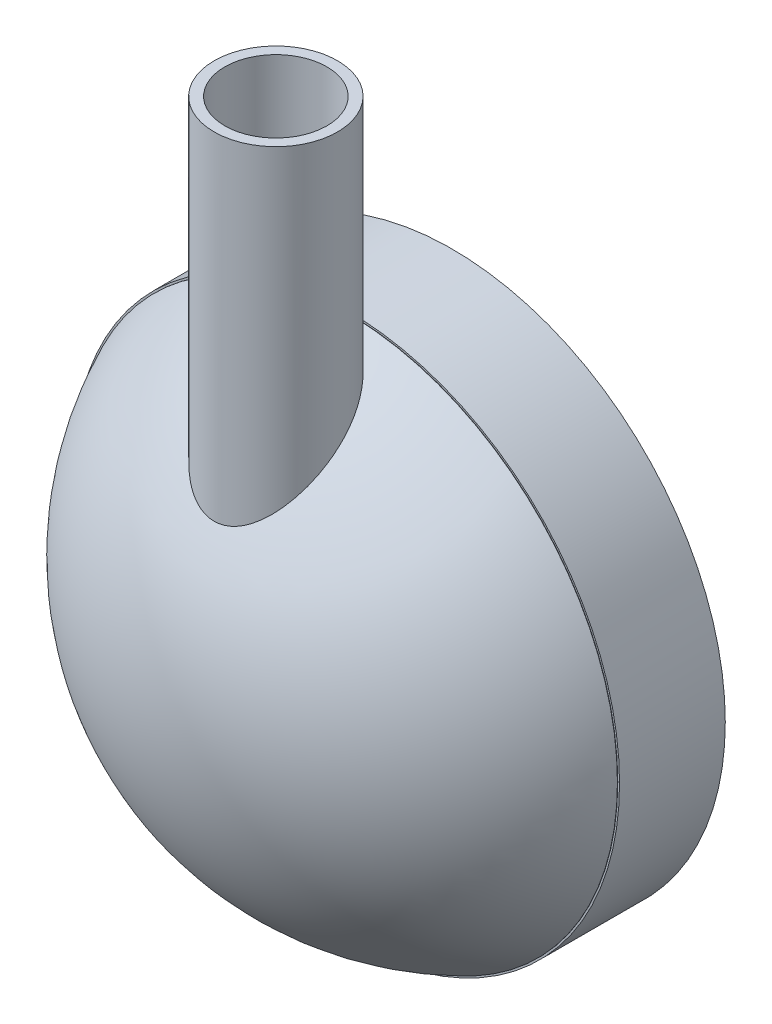
ISO-10303-21;
HEADER;
FILE_DESCRIPTION(('STEP AP214'),'2;1');
FILE_NAME('part.step','',(''),(''),'','','');
FILE_SCHEMA(('AUTOMOTIVE_DESIGN { 1 0 10303 214 1 1 1 1 }'));
ENDSEC;
DATA;
#1=APPLICATION_CONTEXT('core data for automotive mechanical design processes');
#2=APPLICATION_PROTOCOL_DEFINITION('international standard','automotive_design',2000,#1);
#3=PRODUCT_CONTEXT('',#1,'mechanical');
#4=PRODUCT('Part','Part','',(#3));
#5=PRODUCT_RELATED_PRODUCT_CATEGORY('part','',(#4));
#6=PRODUCT_DEFINITION_FORMATION('','',#4);
#7=PRODUCT_DEFINITION_CONTEXT('part definition',#1,'design');
#8=PRODUCT_DEFINITION('design','',#6,#7);
#9=PRODUCT_DEFINITION_SHAPE('','',#8);
#10=(LENGTH_UNIT() NAMED_UNIT(*) SI_UNIT(.MILLI.,.METRE.));
#11=(NAMED_UNIT(*) PLANE_ANGLE_UNIT() SI_UNIT($,.RADIAN.));
#12=(NAMED_UNIT(*) SI_UNIT($,.STERADIAN.) SOLID_ANGLE_UNIT());
#13=UNCERTAINTY_MEASURE_WITH_UNIT(LENGTH_MEASURE(1.E-05),#10,'distance_accuracy_value','');
#14=(GEOMETRIC_REPRESENTATION_CONTEXT(3) GLOBAL_UNCERTAINTY_ASSIGNED_CONTEXT((#13)) GLOBAL_UNIT_ASSIGNED_CONTEXT((#10,
#11,#12)) REPRESENTATION_CONTEXT('',''));
#15=CARTESIAN_POINT('',(0.,0.,0.));
#16=DIRECTION('',(0.,0.,1.));
#17=DIRECTION('',(1.,0.,0.));
#18=AXIS2_PLACEMENT_3D('',#15,#16,#17);
#19=CARTESIAN_POINT('',(0.,0.,-4.19));
#20=DIRECTION('',(0.,0.,1.));
#21=DIRECTION('',(1.,0.,0.));
#22=AXIS2_PLACEMENT_3D('',#19,#20,#21);
#23=SPHERICAL_SURFACE('',#22,84.29);
#24=CARTESIAN_POINT('',(0.,0.,30.1));
#25=DIRECTION('',(0.,0.,1.));
#26=DIRECTION('',(1.,0.,0.));
#27=AXIS2_PLACEMENT_3D('',#24,#25,#26);
#28=CIRCLE('',#27,77.);
#29=CARTESIAN_POINT('',(77.,0.,30.1));
#30=VERTEX_POINT('',#29);
#31=EDGE_CURVE('E62',#30,#30,#28,.T.);
#32=ORIENTED_EDGE('',*,*,#31,.T.);
#33=EDGE_LOOP('',(#32));
#34=FACE_BOUND('',#33,.T.);
#35=CARTESIAN_POINT('',(-9.63469222474683,47.7354714035888,64.60899400145));
#36=CARTESIAN_POINT('',(-10.1618205342646,48.1301078161645,64.2613591958156));
#37=CARTESIAN_POINT('',(-10.6598401083609,48.54443973879,63.8920349933327));
#38=CARTESIAN_POINT('',(-11.6001915047244,49.4019815851679,63.117055940327));
#39=CARTESIAN_POINT('',(-12.0424672587567,49.8452199144252,62.7113652022849));
#40=CARTESIAN_POINT('',(-12.8748919288327,50.7542676089717,61.8675936176552));
#41=CARTESIAN_POINT('',(-13.2648143014862,51.2201638893899,61.4293839881722));
#42=CARTESIAN_POINT('',(-13.9920775643734,52.1666323180765,60.5265228676071));
#43=CARTESIAN_POINT('',(-14.3294303558921,52.6472011150688,60.0618773939764));
#44=CARTESIAN_POINT('',(-15.0048715252983,53.6993930787682,59.0302077687342));
#45=CARTESIAN_POINT('',(-15.3337355513558,54.2728576564931,58.4590160757762));
#46=CARTESIAN_POINT('',(-15.9227985749101,55.4278808015276,57.2899227595152));
#47=CARTESIAN_POINT('',(-16.1829826983682,56.0094410934678,56.6920153831138));
#48=CARTESIAN_POINT('',(-16.6343709008459,57.1753768372738,55.474385199071));
#49=CARTESIAN_POINT('',(-16.8256319664791,57.7597495567494,54.8546808809959));
#50=CARTESIAN_POINT('',(-17.1385355013989,58.9276490449231,53.5972613943492));
#51=CARTESIAN_POINT('',(-17.2601838944337,59.5111758813859,52.9595477631429));
#52=CARTESIAN_POINT('',(-17.4327186269732,60.6770020442723,51.6667389045581));
#53=CARTESIAN_POINT('',(-17.48319473154,61.2592750931872,51.0115649106));
#54=CARTESIAN_POINT('',(-17.5097293203734,62.4154871113066,49.6921866750521));
#55=CARTESIAN_POINT('',(-17.4857794353213,62.9894251359333,49.0279814262455));
#56=CARTESIAN_POINT('',(-17.3606388075821,64.1244254084989,47.6967879036881));
#57=CARTESIAN_POINT('',(-17.2595171079876,64.6854987041661,47.0298026473092));
#58=CARTESIAN_POINT('',(-16.9768777377061,65.7908638869868,45.6990717075079));
#59=CARTESIAN_POINT('',(-16.7953893072266,66.3351618006386,45.0353249345314));
#60=CARTESIAN_POINT('',(-16.40825743448,67.2598092913092,43.8943472468209));
#61=CARTESIAN_POINT('',(-16.2219528126971,67.645181526494,43.4145669660618));
#62=CARTESIAN_POINT('',(-15.8029766066737,68.4021249148378,42.4643886073296));
#63=CARTESIAN_POINT('',(-15.5703093071199,68.773697339568,41.99398966678));
#64=CARTESIAN_POINT('',(-15.0576774407298,69.5001923526423,41.067107534959));
#65=CARTESIAN_POINT('',(-14.7777601672961,69.8551311404656,40.6106109626055));
#66=CARTESIAN_POINT('',(-14.1695533701949,70.5459205633203,39.7157254486219));
#67=CARTESIAN_POINT('',(-13.8412725768339,70.8817746282861,39.2773332571405));
#68=CARTESIAN_POINT('',(-13.2023445260508,71.4700368359492,38.5043491639211));
#69=CARTESIAN_POINT('',(-12.9000217971659,71.7262474310145,38.1657586455133));
#70=CARTESIAN_POINT('',(-12.2632768102596,72.2221353602219,37.5071288419921));
#71=CARTESIAN_POINT('',(-11.9288567594121,72.4618138292511,37.1870882837138));
#72=CARTESIAN_POINT('',(-11.2285420597239,72.9224672159558,36.5691528354973));
#73=CARTESIAN_POINT('',(-10.8626705019345,73.1434556229669,36.2712419929207));
#74=CARTESIAN_POINT('',(-10.2910247606245,73.4593176201155,35.8436774057029));
#75=CARTESIAN_POINT('',(-10.0966717889131,73.56200059044,35.7043740888836));
#76=CARTESIAN_POINT('',(-9.70044239834155,73.7619333636111,35.432599911407));
#77=CARTESIAN_POINT('',(-9.49856402947543,73.8591817416829,35.3001308431619));
#78=CARTESIAN_POINT('',(-8.94363972514514,74.1140082492897,34.9523668853453));
#79=CARTESIAN_POINT('',(-8.58369169980151,74.266168495155,34.7439997093504));
#80=CARTESIAN_POINT('',(-7.84428678075661,74.552407497084,34.35095987583));
#81=CARTESIAN_POINT('',(-7.4648330893419,74.6864892081271,34.1662833462524));
#82=CARTESIAN_POINT('',(-6.68824586279277,74.9351995833017,33.8229316554532));
#83=CARTESIAN_POINT('',(-6.29111583251415,75.0498320823145,33.6642513686579));
#84=CARTESIAN_POINT('',(-5.48141543375667,75.2583598203042,33.3750522250976));
#85=CARTESIAN_POINT('',(-5.06884483819789,75.3522547541593,33.2445337826918));
#86=CARTESIAN_POINT('',(-4.22900089526582,75.5185385298484,33.0130586426871));
#87=CARTESIAN_POINT('',(-3.80166602897488,75.5908210359454,32.9122481456367));
#88=CARTESIAN_POINT('',(-2.9374339086655,75.7122905584037,32.7426716822289));
#89=CARTESIAN_POINT('',(-2.50053657614264,75.7614773850834,32.6739059790513));
#90=CARTESIAN_POINT('',(-1.62089108564555,75.8360473677517,32.5696006126215));
#91=CARTESIAN_POINT('',(-1.17814451307177,75.8614368448748,32.534052126105));
#92=CARTESIAN_POINT('',(-0.290521118924459,75.888060085238,32.4967754320609));
#93=CARTESIAN_POINT('',(0.154355543383838,75.8892956270875,32.4950447343124));
#94=CARTESIAN_POINT('',(1.00427134557051,75.868532614469,32.5241173433024));
#95=CARTESIAN_POINT('',(1.40945807804371,75.8485155726792,32.5521460020332));
#96=CARTESIAN_POINT('',(2.21541841251261,75.7885319830104,32.6360704982499));
#97=CARTESIAN_POINT('',(2.61619230988984,75.7485667787992,32.6919644587852));
#98=CARTESIAN_POINT('',(3.41051709435133,75.649169143576,32.8308144560516));
#99=CARTESIAN_POINT('',(3.8040686411958,75.5897385001702,32.9137680077659));
#100=CARTESIAN_POINT('',(4.58143821841471,75.4520886492022,33.1056011165695));
#101=CARTESIAN_POINT('',(4.96525597674825,75.3738689171591,33.2144813973799));
#102=CARTESIAN_POINT('',(5.72313704093458,75.198963904414,33.4574784488773));
#103=CARTESIAN_POINT('',(6.09712797888756,75.1021706173499,33.591742758381));
#104=CARTESIAN_POINT('',(6.83094347134723,74.8914142138743,33.883421060978));
#105=CARTESIAN_POINT('',(7.19076811668743,74.7774512075766,34.040834905607));
#106=CARTESIAN_POINT('',(7.89465295126496,74.5334041692978,34.3770487750717));
#107=CARTESIAN_POINT('',(8.23871086645541,74.4033178217967,34.5558518715514));
#108=CARTESIAN_POINT('',(8.90971456153488,74.1281375902148,34.9329779550346));
#109=CARTESIAN_POINT('',(9.23665828645599,73.9830419101016,35.1313032779506));
#110=CARTESIAN_POINT('',(9.90573929639754,73.6630107252022,35.5673283457427));
#111=CARTESIAN_POINT('',(10.2458754742925,73.4865416262001,35.8069762094788));
#112=CARTESIAN_POINT('',(10.9029705179701,73.1181635343707,36.3052789334953));
#113=CARTESIAN_POINT('',(11.2199280249768,72.9262536377586,36.5639349062866));
#114=CARTESIAN_POINT('',(12.1351951493392,72.3293906764523,37.364968369668));
#115=CARTESIAN_POINT('',(12.6980501326201,71.9032313199886,37.9325112840581));
#116=CARTESIAN_POINT('',(13.8153092432989,70.9276763766797,39.2188524294654));
#117=CARTESIAN_POINT('',(14.3515388558225,70.3696997304661,39.9468612142282));
#118=CARTESIAN_POINT('',(15.0574001798865,69.4965647035361,41.0713313107249));
#119=CARTESIAN_POINT('',(15.2763728128412,69.1993065738174,41.4517965996273));
#120=CARTESIAN_POINT('',(15.6822024611091,68.5940310605825,42.2213354522294));
#121=CARTESIAN_POINT('',(15.8690581066944,68.2860132188591,42.6104093822726));
#122=CARTESIAN_POINT('',(16.2468215615074,67.595662480056,43.4763521626213));
#123=CARTESIAN_POINT('',(16.4305029456572,67.2111872967619,43.9546643777718));
#124=CARTESIAN_POINT('',(16.753221773707,66.4307802273104,44.9169748374916));
#125=CARTESIAN_POINT('',(16.8922540684864,66.0348470255018,45.4009737312056));
#126=CARTESIAN_POINT('',(17.1270271526935,65.2333596175696,46.3717238364064));
#127=CARTESIAN_POINT('',(17.2227540906127,64.8278023767255,46.8584758781719));
#128=CARTESIAN_POINT('',(17.3721554649138,64.0089496259527,47.8318882730032));
#129=CARTESIAN_POINT('',(17.4258281133951,63.5956537877893,48.3185486212913));
#130=CARTESIAN_POINT('',(17.4990653292932,62.6786614398899,49.3876534694212));
#131=CARTESIAN_POINT('',(17.5095325874107,62.1735920563319,49.9695571630562));
#132=CARTESIAN_POINT('',(17.4733127289245,61.1572253854348,51.1261314749178));
#133=CARTESIAN_POINT('',(17.4266185182455,60.6459273328785,51.7008011864217));
#134=CARTESIAN_POINT('',(17.2775256419665,59.6189649711866,52.8403857460969));
#135=CARTESIAN_POINT('',(17.1750480212357,59.1032954956251,53.4052855940564));
#136=CARTESIAN_POINT('',(16.9155278959145,58.0709323764062,54.5214182378472));
#137=CARTESIAN_POINT('',(16.7584848567309,57.554238722764,55.0726508997204));
#138=CARTESIAN_POINT('',(16.3654609573264,56.4521422578945,56.2326729481332));
#139=CARTESIAN_POINT('',(16.1216336085227,55.8669828833373,56.8390544540945));
#140=CARTESIAN_POINT('',(15.5646818130478,54.7033006305848,58.0262546607971));
#141=CARTESIAN_POINT('',(15.2515373348647,54.1247797217331,58.6070659138686));
#142=CARTESIAN_POINT('',(14.5557734065386,52.980856112026,59.7375307517814));
#143=CARTESIAN_POINT('',(14.1732462274002,52.4154371001144,60.2872244605005));
#144=CARTESIAN_POINT('',(13.3367941374115,51.3042138411895,61.3506515766683));
#145=CARTESIAN_POINT('',(12.8829148198834,50.758397340106,61.864407647056));
#146=CARTESIAN_POINT('',(12.0971461463222,49.9082458353304,62.6524007323927));
#147=CARTESIAN_POINT('',(11.7889548607783,49.5945464156342,62.9403344118918));
#148=CARTESIAN_POINT('',(11.1449325489721,48.9803409273614,63.4989698201894));
#149=CARTESIAN_POINT('',(10.8091035769792,48.6798338807563,63.7696728270712));
#150=CARTESIAN_POINT('',(10.1094351403764,48.095725457479,64.2912383872606));
#151=CARTESIAN_POINT('',(9.74563112150831,47.8121034698412,64.5421252569746));
#152=CARTESIAN_POINT('',(8.98894967525549,47.2655118392575,65.021627590362));
#153=CARTESIAN_POINT('',(8.59607976019743,47.0025368958763,65.2502487736503));
#154=CARTESIAN_POINT('',(7.8812751415455,46.563878785359,65.6287030081285));
#155=CARTESIAN_POINT('',(7.56567687677083,46.3826400194559,65.7840795090202));
#156=CARTESIAN_POINT('',(6.91786225852598,46.0373180474911,66.078548978292));
#157=CARTESIAN_POINT('',(6.58564678442967,45.8732339350313,66.2176428070441));
#158=CARTESIAN_POINT('',(5.90550359275257,45.5652526307485,66.4774816373325));
#159=CARTESIAN_POINT('',(5.55759360690272,45.421333376055,66.5982467050563));
#160=CARTESIAN_POINT('',(4.84684547420208,45.1565624699132,66.8195277188379));
#161=CARTESIAN_POINT('',(4.48401031902267,45.0357062227309,66.9200476993282));
#162=CARTESIAN_POINT('',(3.81086094112527,44.8392958210442,67.0828881288511));
#163=CARTESIAN_POINT('',(3.50265275858346,44.7595083689323,67.148821885709));
#164=CARTESIAN_POINT('',(2.87890510917004,44.6192559439055,67.2644854125106));
#165=CARTESIAN_POINT('',(2.56336712427924,44.5587871008994,67.3142184279831));
#166=CARTESIAN_POINT('',(1.92699260035902,44.4585609623175,67.3965388324821));
#167=CARTESIAN_POINT('',(1.60615948100956,44.4187908006546,67.4291368725587));
#168=CARTESIAN_POINT('',(0.961223106558646,44.3608827564995,67.4765724978154));
#169=CARTESIAN_POINT('',(0.637119821686242,44.3427450711249,67.4914099211588));
#170=CARTESIAN_POINT('',(-0.0125559970443343,44.328558096109,67.5030170701446));
#171=CARTESIAN_POINT('',(-0.338130177783476,44.3325537066235,67.4997500686943));
#172=CARTESIAN_POINT('',(-0.987562485381796,44.3626325041723,67.4751343337306));
#173=CARTESIAN_POINT('',(-1.31142060095197,44.3887158363281,67.4537854814152));
#174=CARTESIAN_POINT('',(-1.95519098192867,44.4623225126324,67.3934417943763));
#175=CARTESIAN_POINT('',(-2.27510097598812,44.5098576566356,67.354437247867));
#176=CARTESIAN_POINT('',(-2.90866854452908,44.6252241460277,67.2595560721638));
#177=CARTESIAN_POINT('',(-3.22232604365041,44.6930557358883,67.2036792397423));
#178=CARTESIAN_POINT('',(-3.83634585943456,44.8462076476786,67.0771489352492));
#179=CARTESIAN_POINT('',(-4.13684386956309,44.9312085945944,67.0067648896112));
#180=CARTESIAN_POINT('',(-4.72892217252098,45.1177947028725,66.8517376254357));
#181=CARTESIAN_POINT('',(-5.02049918969917,45.2193858711571,66.767089241767));
#182=CARTESIAN_POINT('',(-5.88014444031941,45.5464744257818,66.4934859878299));
#183=CARTESIAN_POINT('',(-6.43360543710664,45.7944105126203,66.2847716495347));
#184=CARTESIAN_POINT('',(-7.4458370652308,46.3109768230828,65.845650467187));
#185=CARTESIAN_POINT('',(-7.90859991425019,46.5753511643641,65.6192353852625));
#186=CARTESIAN_POINT('',(-8.79832460861389,47.1343480385026,65.1359052103736));
#187=CARTESIAN_POINT('',(-9.22528783323385,47.428969405039,64.8789912933802));
#188=CARTESIAN_POINT('',(-9.63469222474683,47.7354714035888,64.60899400145));
#189=B_SPLINE_CURVE_WITH_KNOTS('',3,(#35,#36,#37,#38,#39,#40,#41,#42,#43,#44,#45,#46,#47,#48,
#49,#50,#51,#52,#53,#54,#55,#56,#57,#58,#59,#60,#61,#62,#63,#64,#65,#66,#67,#68,#69,#70,#71,#72,
#73,#74,#75,#76,#77,#78,#79,#80,#81,#82,#83,#84,#85,#86,#87,#88,#89,#90,#91,#92,#93,#94,#95,#96,
#97,#98,#99,#100,#101,#102,#103,#104,#105,#106,#107,#108,#109,#110,#111,#112,#113,#114,#115,
#116,#117,#118,#119,#120,#121,#122,#123,#124,#125,#126,#127,#128,#129,#130,#131,#132,#133,#134,
#135,#136,#137,#138,#139,#140,#141,#142,#143,#144,#145,#146,#147,#148,#149,#150,#151,#152,#153,
#154,#155,#156,#157,#158,#159,#160,#161,#162,#163,#164,#165,#166,#167,#168,#169,#170,#171,#172,
#173,#174,#175,#176,#177,#178,#179,#180,#181,#182,#183,#184,#185,#186,#187,#188),.UNSPECIFIED.,
.T.,.F.,(4,2,2,2,2,2,2,2,2,2,2,2,2,2,2,2,2,2,2,2,2,2,2,2,2,2,2,2,2,2,2,2,2,2,2,2,2,2,2,2,2,2,2,
2,2,2,2,2,2,2,2,2,2,2,2,2,2,2,2,2,2,2,2,2,2,2,2,2,2,2,2,2,2,2,2,2,4),(0.,2.23296671018859,
4.46816175684855,6.71273697435813,8.95680329945026,11.5743990469664,14.1925612241773,
16.8085536719327,19.4243234765215,22.0551097111934,24.6861917925928,27.3149226866977,
29.9426979420423,31.8699147789577,33.7969535913438,35.7220749083118,37.6468491382116,
39.2090956508595,40.7712348124158,42.3322367216681,43.11272243253,43.8934118108023,
45.2205529073382,46.5474768158575,47.8741387844936,49.2008202716355,50.5339256615725,
51.8670419999347,53.1998041308824,54.5324681216272,55.7509560898014,56.9693619941704,
58.1876560377515,59.4059840928966,60.6316241308681,61.8572563088209,63.0830647077688,
64.3090199582895,65.6635140601042,67.0180875012924,69.7266549195287,72.9020261574969,
74.4915754376976,76.0811924923041,78.0011293997197,79.9212876428762,81.842059628008,
83.7629132686116,86.0723788539432,88.3821310866284,90.6951610460547,93.0082136675494,
95.6368403208082,98.2662275980108,100.892143395124,103.516388027261,105.092314456885,
106.668123855788,108.241968524063,109.815407830439,111.001632135372,112.187793732224,
113.372647212825,114.55726434218,115.531659604369,116.505859543669,117.479453204914,
118.453055737581,119.428634066978,120.404218806197,121.380340834123,122.356474619966,
123.315892715637,124.275658967022,126.193691472577,127.928035084491,129.662311845475),.UNSPECIFIED.);
#190=CARTESIAN_POINT('',(-9.63469222474683,47.7354714035888,64.60899400145));
#191=VERTEX_POINT('',#190);
#192=EDGE_CURVE('E41',#191,#191,#189,.T.);
#193=ORIENTED_EDGE('',*,*,#192,.T.);
#194=EDGE_LOOP('',(#193));
#195=FACE_BOUND('',#194,.T.);
#196=ADVANCED_FACE('F37',(#34,#195),#23,.T.);
#197=CARTESIAN_POINT('',(0.,0.,30.));
#198=DIRECTION('',(0.,0.,-1.));
#199=DIRECTION('',(-1.,0.,0.));
#200=AXIS2_PLACEMENT_3D('',#197,#198,#199);
#201=CYLINDRICAL_SURFACE('',#200,77.5);
#202=CARTESIAN_POINT('',(0.,0.,30.));
#203=DIRECTION('',(0.,0.,1.));
#204=DIRECTION('',(1.,0.,0.));
#205=AXIS2_PLACEMENT_3D('',#202,#203,#204);
#206=CIRCLE('',#205,77.5);
#207=CARTESIAN_POINT('',(77.5,0.,30.));
#208=VERTEX_POINT('',#207);
#209=EDGE_CURVE('E50',#208,#208,#206,.T.);
#210=ORIENTED_EDGE('',*,*,#209,.F.);
#211=EDGE_LOOP('',(#210));
#212=FACE_BOUND('',#211,.T.);
#213=CARTESIAN_POINT('',(0.,0.,0.));
#214=DIRECTION('',(0.,0.,1.));
#215=DIRECTION('',(1.,0.,0.));
#216=AXIS2_PLACEMENT_3D('',#213,#214,#215);
#217=CIRCLE('',#216,77.5);
#218=CARTESIAN_POINT('',(77.5,0.,0.));
#219=VERTEX_POINT('',#218);
#220=EDGE_CURVE('E56',#219,#219,#217,.T.);
#221=ORIENTED_EDGE('',*,*,#220,.T.);
#222=EDGE_LOOP('',(#221));
#223=FACE_BOUND('',#222,.T.);
#224=ADVANCED_FACE('F69',(#212,#223),#201,.T.);
#225=CARTESIAN_POINT('',(0.,0.,30.));
#226=DIRECTION('',(0.,0.,1.));
#227=DIRECTION('',(1.,0.,0.));
#228=AXIS2_PLACEMENT_3D('',#225,#226,#227);
#229=PLANE('',#228);
#230=CARTESIAN_POINT('',(0.,0.,30.));
#231=DIRECTION('',(0.,0.,1.));
#232=DIRECTION('',(1.,0.,0.));
#233=AXIS2_PLACEMENT_3D('',#230,#231,#232);
#234=CIRCLE('',#233,77.);
#235=CARTESIAN_POINT('',(77.,0.,30.));
#236=VERTEX_POINT('',#235);
#237=EDGE_CURVE('E10',#236,#236,#234,.T.);
#238=ORIENTED_EDGE('',*,*,#237,.F.);
#239=EDGE_LOOP('',(#238));
#240=FACE_BOUND('',#239,.T.);
#241=ORIENTED_EDGE('',*,*,#209,.T.);
#242=EDGE_LOOP('',(#241));
#243=FACE_BOUND('',#242,.T.);
#244=ADVANCED_FACE('F73',(#240,#243),#229,.T.);
#245=CARTESIAN_POINT('',(0.,0.,192.708333333333));
#246=DIRECTION('',(0.,0.,1.));
#247=DIRECTION('',(1.,0.,0.));
#248=AXIS2_PLACEMENT_3D('',#245,#246,#247);
#249=SPHERICAL_SURFACE('',#248,207.708333333333);
#250=ORIENTED_EDGE('',*,*,#220,.F.);
#251=EDGE_LOOP('',(#250));
#252=FACE_BOUND('',#251,.T.);
#253=ADVANCED_FACE('F39',(#252),#249,.T.);
#254=CARTESIAN_POINT('',(0.,0.,30.1));
#255=DIRECTION('',(0.,0.,-1.));
#256=DIRECTION('',(-1.,0.,0.));
#257=AXIS2_PLACEMENT_3D('',#254,#255,#256);
#258=CYLINDRICAL_SURFACE('',#257,77.);
#259=ORIENTED_EDGE('',*,*,#31,.F.);
#260=EDGE_LOOP('',(#259));
#261=FACE_BOUND('',#260,.T.);
#262=ORIENTED_EDGE('',*,*,#237,.T.);
#263=EDGE_LOOP('',(#262));
#264=FACE_BOUND('',#263,.T.);
#265=ADVANCED_FACE('F72',(#261,#264),#258,.T.);
#266=CARTESIAN_POINT('',(0.,140.,50.));
#267=DIRECTION('',(0.,-1.,0.));
#268=DIRECTION('',(0.,0.,-1.));
#269=AXIS2_PLACEMENT_3D('',#266,#267,#268);
#270=CYLINDRICAL_SURFACE('',#269,17.5);
#271=ORIENTED_EDGE('',*,*,#192,.F.);
#272=EDGE_LOOP('',(#271));
#273=FACE_BOUND('',#272,.T.);
#274=CARTESIAN_POINT('',(0.,140.,50.));
#275=DIRECTION('',(0.,1.,0.));
#276=DIRECTION('',(0.,0.,1.));
#277=AXIS2_PLACEMENT_3D('',#274,#275,#276);
#278=CIRCLE('',#277,17.5);
#279=CARTESIAN_POINT('',(0.,140.,67.5));
#280=VERTEX_POINT('',#279);
#281=EDGE_CURVE('E59',#280,#280,#278,.T.);
#282=ORIENTED_EDGE('',*,*,#281,.F.);
#283=EDGE_LOOP('',(#282));
#284=FACE_BOUND('',#283,.T.);
#285=ADVANCED_FACE('F78',(#273,#284),#270,.T.);
#286=CARTESIAN_POINT('',(0.,140.,50.));
#287=DIRECTION('',(0.,1.,0.));
#288=DIRECTION('',(0.,0.,1.));
#289=AXIS2_PLACEMENT_3D('',#286,#287,#288);
#290=PLANE('',#289);
#291=CARTESIAN_POINT('',(0.,140.,50.));
#292=DIRECTION('',(0.,1.,0.));
#293=DIRECTION('',(0.,0.,1.));
#294=AXIS2_PLACEMENT_3D('',#291,#292,#293);
#295=CIRCLE('',#294,14.5);
#296=CARTESIAN_POINT('',(0.,140.,64.5));
#297=VERTEX_POINT('',#296);
#298=EDGE_CURVE('E133',#297,#297,#295,.T.);
#299=ORIENTED_EDGE('',*,*,#298,.F.);
#300=EDGE_LOOP('',(#299));
#301=FACE_BOUND('',#300,.T.);
#302=ORIENTED_EDGE('',*,*,#281,.T.);
#303=EDGE_LOOP('',(#302));
#304=FACE_BOUND('',#303,.T.);
#305=ADVANCED_FACE('F95',(#301,#304),#290,.T.);
#306=CARTESIAN_POINT('',(0.,0.,-4.19));
#307=DIRECTION('',(0.,0.,1.));
#308=DIRECTION('',(1.,0.,0.));
#309=AXIS2_PLACEMENT_3D('',#306,#307,#308);
#310=SPHERICAL_SURFACE('',#309,81.29);
#311=CARTESIAN_POINT('',(0.,0.,29.4561602564097));
#312=DIRECTION('',(0.,0.,-1.));
#313=DIRECTION('',(-1.,0.,0.));
#314=AXIS2_PLACEMENT_3D('',#311,#312,#313);
#315=CIRCLE('',#314,74.);
#316=CARTESIAN_POINT('',(-74.,0.,29.4561602564097));
#317=VERTEX_POINT('',#316);
#318=EDGE_CURVE('E132',#317,#317,#315,.F.);
#319=ORIENTED_EDGE('',*,*,#318,.F.);
#320=EDGE_LOOP('',(#319));
#321=FACE_BOUND('',#320,.T.);
#322=CARTESIAN_POINT('',(9.84596877818571,67.93317776201,39.3554286690824));
#323=CARTESIAN_POINT('',(10.2454870254106,67.6383890125242,39.7249780114884));
#324=CARTESIAN_POINT('',(10.6183018904441,67.3280546075115,40.111601173655));
#325=CARTESIAN_POINT('',(11.3101888082684,66.681537815027,40.9110097289654));
#326=CARTESIAN_POINT('',(11.6291916038527,66.34532291674,41.3238279098565));
#327=CARTESIAN_POINT('',(12.215563430587,65.6498996841953,42.170789238734));
#328=CARTESIAN_POINT('',(12.4826651873186,65.2905843835032,42.6050290454998));
#329=CARTESIAN_POINT('',(12.9646775792647,64.5544473980438,43.4869608129664));
#330=CARTESIAN_POINT('',(13.1796028048708,64.1776306424919,43.9346489735938));
#331=CARTESIAN_POINT('',(13.5753139423045,63.3770264523389,44.8771359673337));
#332=CARTESIAN_POINT('',(13.7516611607749,62.9519651633315,45.3727111995701));
#333=CARTESIAN_POINT('',(14.0476428448571,62.0883896001862,46.3690385726886));
#334=CARTESIAN_POINT('',(14.1672677977966,61.649873082644,46.8697915675349));
#335=CARTESIAN_POINT('',(14.3519385869521,60.7630642454667,47.8714188727269));
#336=CARTESIAN_POINT('',(14.4170556914797,60.3147854796291,48.3722921654685));
#337=CARTESIAN_POINT('',(14.495013947001,59.41061670079,49.3711110120306));
#338=CARTESIAN_POINT('',(14.5078574394587,58.9547270296183,49.8690566959883));
#339=CARTESIAN_POINT('',(14.4828162379241,58.0308037289834,50.8664002223422));
#340=CARTESIAN_POINT('',(14.444155816052,57.5626908973742,51.3657046386319));
#341=CARTESIAN_POINT('',(14.3161602970544,56.6236276382565,52.3550771443992));
#342=CARTESIAN_POINT('',(14.2268228801776,56.1526770818268,52.8451448100011));
#343=CARTESIAN_POINT('',(13.9983626438946,55.2101629997194,53.8136014966966));
#344=CARTESIAN_POINT('',(13.8592055538246,54.738599275284,54.2919822358393));
#345=CARTESIAN_POINT('',(13.5315862084658,53.797928858638,55.2340099244495));
#346=CARTESIAN_POINT('',(13.3431280187741,53.3288219670778,55.6976580852996));
#347=CARTESIAN_POINT('',(12.9301818278319,52.4254376560813,56.578912430976));
#348=CARTESIAN_POINT('',(12.7086998815055,51.9908230823167,56.9975814704042));
#349=CARTESIAN_POINT('',(12.2216565172255,51.1294127705108,57.8171858191621));
#350=CARTESIAN_POINT('',(11.9560895608031,50.7026180223766,58.2181188922689));
#351=CARTESIAN_POINT('',(11.3800938530871,49.8612477619578,58.9988071955396));
#352=CARTESIAN_POINT('',(11.0697229910613,49.4466573007223,59.3785888901994));
#353=CARTESIAN_POINT('',(10.4021684979725,48.634104945026,60.1139193110782));
#354=CARTESIAN_POINT('',(10.0450075860504,48.2361351032293,60.4694796715432));
#355=CARTESIAN_POINT('',(9.4190543076304,47.6024902579404,61.0289932375249));
#356=CARTESIAN_POINT('',(9.16473078363418,47.3599611937357,61.2414484380592));
#357=CARTESIAN_POINT('',(8.63525269433694,46.8865694821454,61.653105241461));
#358=CARTESIAN_POINT('',(8.36009908152409,46.6557063021231,61.8523074495605));
#359=CARTESIAN_POINT('',(7.78869468758233,46.2086350162927,62.2353752941592));
#360=CARTESIAN_POINT('',(7.4924703179768,45.9924092044343,62.419259524445));
#361=CARTESIAN_POINT('',(6.87808257252651,45.577552873617,62.7697700245306));
#362=CARTESIAN_POINT('',(6.55991767869235,45.3789235742768,62.9363950982291));
#363=CARTESIAN_POINT('',(5.98032861508409,45.0481812346867,63.2122148751215));
#364=CARTESIAN_POINT('',(5.72350328134667,44.9115125322392,63.3256209127588));
#365=CARTESIAN_POINT('',(5.19751949068461,44.6527791770083,63.5394356042982));
#366=CARTESIAN_POINT('',(4.92836803419566,44.5307063735353,63.6398515147808));
#367=CARTESIAN_POINT('',(4.37845466020897,44.3033769556797,63.8261829901084));
#368=CARTESIAN_POINT('',(4.09770297637313,44.1981059014446,63.9121110098381));
#369=CARTESIAN_POINT('',(3.52547281154337,44.0065475786268,64.0680103431319));
#370=CARTESIAN_POINT('',(3.23399617868062,43.920257057022,64.1379843910792));
#371=CARTESIAN_POINT('',(2.68850115439294,43.7807523667747,64.2508562014892));
#372=CARTESIAN_POINT('',(2.4357877189834,43.7244720428771,64.2962802724274));
#373=CARTESIAN_POINT('',(1.9252859652593,43.628129073094,64.3739313822928));
#374=CARTESIAN_POINT('',(1.66749817762272,43.5880647406832,64.4061597936232));
#375=CARTESIAN_POINT('',(1.14861781552734,43.5250825438711,64.4567834162565));
#376=CARTESIAN_POINT('',(0.887527069255226,43.5021555828432,64.4751859664417));
#377=CARTESIAN_POINT('',(0.363768271070946,43.4739691556853,64.4978059393167));
#378=CARTESIAN_POINT('',(0.101100189740357,43.4687100201044,64.5020230966105));
#379=CARTESIAN_POINT('',(-0.424003049208438,43.4759947072552,64.4961791541333));
#380=CARTESIAN_POINT('',(-0.686437935053342,43.4885503933098,64.486108539788));
#381=CARTESIAN_POINT('',(-1.20893888828629,43.5311728508795,64.4518863233219));
#382=CARTESIAN_POINT('',(-1.46900499814953,43.5612393077735,64.4277349741936));
#383=CARTESIAN_POINT('',(-1.98512499474139,43.6381893252163,64.3658230903613));
#384=CARTESIAN_POINT('',(-2.24117662490878,43.6850820134484,64.3280551690567));
#385=CARTESIAN_POINT('',(-2.74762725458986,43.7946504851351,64.2396159972597));
#386=CARTESIAN_POINT('',(-2.99802510157066,43.8573294555561,64.1889421412682));
#387=CARTESIAN_POINT('',(-3.55338071818184,44.0146427423322,64.0614214113399));
#388=CARTESIAN_POINT('',(-3.85641571127234,44.1133476005688,63.9811995122227));
#389=CARTESIAN_POINT('',(-4.450032262958,44.3308058725785,63.8037410507361));
#390=CARTESIAN_POINT('',(-4.74061093012118,44.4495639099475,63.7065005642577));
#391=CARTESIAN_POINT('',(-5.30868035992597,44.7046604031089,63.4966563259642));
#392=CARTESIAN_POINT('',(-5.58615192146581,44.8410236212491,63.3840309214741));
#393=CARTESIAN_POINT('',(-6.12707461131841,45.1287210828739,63.1452043520104));
#394=CARTESIAN_POINT('',(-6.39052478333697,45.2800563454825,63.0190022628415));
#395=CARTESIAN_POINT('',(-7.01556831295196,45.6645474633045,62.6966082064793));
#396=CARTESIAN_POINT('',(-7.36965321158673,45.9045256313292,62.4939576752133));
#397=CARTESIAN_POINT('',(-8.0491254261244,46.4053211349807,62.0674198393905));
#398=CARTESIAN_POINT('',(-8.37450045384368,46.6661473036571,61.8435235256484));
#399=CARTESIAN_POINT('',(-8.99788314161651,47.2045934080629,61.3771631248359));
#400=CARTESIAN_POINT('',(-9.29584648613572,47.4822393745928,61.1346700943417));
#401=CARTESIAN_POINT('',(-9.8648158645034,48.0503981904472,60.6338626602479));
#402=CARTESIAN_POINT('',(-10.1358222319367,48.3409108804854,60.3755484524948));
#403=CARTESIAN_POINT('',(-10.7655740682052,49.0622378335123,59.728139285118));
#404=CARTESIAN_POINT('',(-11.1104107262564,49.498505420006,59.3315406486434));
#405=CARTESIAN_POINT('',(-11.7486849975396,50.3856384402468,58.5139557792045));
#406=CARTESIAN_POINT('',(-12.0421011696646,50.8365098710421,58.0929594698999));
#407=CARTESIAN_POINT('',(-12.5791719492135,51.748228548066,57.2299942280046));
#408=CARTESIAN_POINT('',(-12.8227972540047,52.2090814931378,56.7880131330237));
#409=CARTESIAN_POINT('',(-13.2608926791607,53.1366494835377,55.8864146443396));
#410=CARTESIAN_POINT('',(-13.455369068402,53.6033637732801,55.4267995084565));
#411=CARTESIAN_POINT('',(-13.7994699927404,54.5507610881138,54.4814741575645));
#412=CARTESIAN_POINT('',(-13.947915687155,55.0315120192319,53.9954031302023));
#413=CARTESIAN_POINT('',(-14.1931378703072,55.9930653817965,53.0103876658193));
#414=CARTESIAN_POINT('',(-14.2899109690486,56.4738678145526,52.5114423864299));
#415=CARTESIAN_POINT('',(-14.4307761173338,57.432624926984,51.503795255855));
#416=CARTESIAN_POINT('',(-14.4748866660686,57.9105805479426,50.9950968945514));
#417=CARTESIAN_POINT('',(-14.5090186553762,58.8611338218423,49.9709426106934));
#418=CARTESIAN_POINT('',(-14.4990454075343,59.3337319963717,49.4554873566956));
#419=CARTESIAN_POINT('',(-14.4262115295864,60.232771362128,48.4633385908427));
#420=CARTESIAN_POINT('',(-14.3677121154578,60.6598438898492,47.9868970757013));
#421=CARTESIAN_POINT('',(-14.2017141571418,61.5048987555118,47.0343598647186));
#422=CARTESIAN_POINT('',(-14.094213993536,61.9228807925446,46.5582641808275));
#423=CARTESIAN_POINT('',(-13.8283713333044,62.7468595617109,45.6104377939957));
#424=CARTESIAN_POINT('',(-13.670064302982,63.1528644393932,45.1387042816264));
#425=CARTESIAN_POINT('',(-13.3005543135102,63.9501903325849,44.2036350230627));
#426=CARTESIAN_POINT('',(-13.089365172582,64.3415151533618,43.7402971169402));
#427=CARTESIAN_POINT('',(-12.6658350208878,65.0200050717924,42.9299207239181));
#428=CARTESIAN_POINT('',(-12.4644454880353,65.3107946471885,42.5801721706552));
#429=CARTESIAN_POINT('',(-12.0278517538527,65.8796823218648,41.8915511761025));
#430=CARTESIAN_POINT('',(-11.7926495151017,66.1577811565159,41.5526781049664));
#431=CARTESIAN_POINT('',(-11.2880304957335,66.698897108718,40.8893547448389));
#432=CARTESIAN_POINT('',(-11.0186495056159,66.9619295908125,40.5648898412659));
#433=CARTESIAN_POINT('',(-10.4451262552788,67.470823368883,39.9336658502452));
#434=CARTESIAN_POINT('',(-10.1409905539251,67.7166878907118,39.626903438397));
#435=CARTESIAN_POINT('',(-9.56011990945995,68.1430367805364,39.0922756741945));
#436=CARTESIAN_POINT('',(-9.28941720446901,68.3269839884367,38.8606061984002));
#437=CARTESIAN_POINT('',(-8.72582925699209,68.6804009071418,38.4138378138514));
#438=CARTESIAN_POINT('',(-8.43294860942032,68.8498736014349,38.1987354911755));
#439=CARTESIAN_POINT('',(-7.82568207124868,69.1727250342067,37.7875824005478));
#440=CARTESIAN_POINT('',(-7.51129644384877,69.3261039695991,37.5915313994975));
#441=CARTESIAN_POINT('',(-6.86216407606621,69.6150577841847,37.2210981009443));
#442=CARTESIAN_POINT('',(-6.52741697361522,69.7506323466445,37.0467161889297));
#443=CARTESIAN_POINT('',(-5.83633099518283,70.0033036658549,36.7209040840485));
#444=CARTESIAN_POINT('',(-5.47983323801567,70.1202341711832,36.5696808252124));
#445=CARTESIAN_POINT('',(-4.75017027282052,70.3324966026847,36.2946041820462));
#446=CARTESIAN_POINT('',(-4.37700471689877,70.4278280777861,36.170751369319));
#447=CARTESIAN_POINT('',(-3.61729002130561,70.5952588089045,35.9528921300975));
#448=CARTESIAN_POINT('',(-3.23075157763844,70.6673761772635,35.8588624355575));
#449=CARTESIAN_POINT('',(-2.4476205487913,70.7871784177356,35.7025002900995));
#450=CARTESIAN_POINT('',(-2.05102974248983,70.8348675814494,35.6401622715325));
#451=CARTESIAN_POINT('',(-1.30839747413794,70.8999696044772,35.5550211551935));
#452=CARTESIAN_POINT('',(-0.963136408246491,70.9207096707486,35.5278746826274));
#453=CARTESIAN_POINT('',(-0.270956765893843,70.9432309720537,35.4983955946315));
#454=CARTESIAN_POINT('',(0.075961626401904,70.9450142667327,35.4960602834797));
#455=CARTESIAN_POINT('',(0.768509325903146,70.9296004161359,35.5162376893484));
#456=CARTESIAN_POINT('',(1.11413907800819,70.9124105785067,35.5387408396463));
#457=CARTESIAN_POINT('',(1.80147481396636,70.8593135149075,35.6081970068637));
#458=CARTESIAN_POINT('',(2.1431808400765,70.823406490708,35.6551497602175));
#459=CARTESIAN_POINT('',(2.79927474527876,70.7361502549656,35.7691162625055));
#460=CARTESIAN_POINT('',(3.1140531653623,70.6858826261261,35.8347237745705));
#461=CARTESIAN_POINT('',(3.73585598949672,70.5699114503817,35.9858733827397));
#462=CARTESIAN_POINT('',(4.04288078977237,70.5042086940161,36.0714144579067));
#463=CARTESIAN_POINT('',(4.64757883357751,70.3580713297011,36.2613501983326));
#464=CARTESIAN_POINT('',(4.94524795244749,70.2776303279105,36.3657530460527));
#465=CARTESIAN_POINT('',(5.52961982729459,70.1028722420132,36.5921104814398));
#466=CARTESIAN_POINT('',(5.81632229041183,70.0085547876673,36.7140655374175));
#467=CARTESIAN_POINT('',(6.39611368629533,69.8002699577889,36.9827630620409));
#468=CARTESIAN_POINT('',(6.6883708459399,69.6854155294062,37.130611476284));
#469=CARTESIAN_POINT('',(7.2580085317497,69.4420236592799,37.4430537055047));
#470=CARTESIAN_POINT('',(7.53538221912561,69.3134800070992,37.6076551193608));
#471=CARTESIAN_POINT('',(8.07388066600085,69.0440707818326,37.9515815466698));
#472=CARTESIAN_POINT('',(8.33502799917465,68.9032230138933,38.1308852622487));
#473=CARTESIAN_POINT('',(8.84093640955329,68.6101280518061,38.502766143407));
#474=CARTESIAN_POINT('',(9.08569866975841,68.4578816823209,38.6953423486722));
#475=CARTESIAN_POINT('',(9.41180985777014,68.2407102457856,38.9690629292701));
#476=CARTESIAN_POINT('',(9.50035518710522,68.1801935574478,39.0452385171684));
#477=CARTESIAN_POINT('',(9.67499119798067,68.0577440920876,39.1991624101509));
#478=CARTESIAN_POINT('',(9.76108273584768,67.9958118230158,39.2769101499826));
#479=CARTESIAN_POINT('',(9.84596877818571,67.93317776201,39.3554286690824));
#480=B_SPLINE_CURVE_WITH_KNOTS('',3,(#322,#323,#324,#325,#326,#327,#328,#329,#330,#331,#332,
#333,#334,#335,#336,#337,#338,#339,#340,#341,#342,#343,#344,#345,#346,#347,#348,#349,#350,#351,
#352,#353,#354,#355,#356,#357,#358,#359,#360,#361,#362,#363,#364,#365,#366,#367,#368,#369,#370,
#371,#372,#373,#374,#375,#376,#377,#378,#379,#380,#381,#382,#383,#384,#385,#386,#387,#388,#389,
#390,#391,#392,#393,#394,#395,#396,#397,#398,#399,#400,#401,#402,#403,#404,#405,#406,#407,#408,
#409,#410,#411,#412,#413,#414,#415,#416,#417,#418,#419,#420,#421,#422,#423,#424,#425,#426,#427,
#428,#429,#430,#431,#432,#433,#434,#435,#436,#437,#438,#439,#440,#441,#442,#443,#444,#445,#446,
#447,#448,#449,#450,#451,#452,#453,#454,#455,#456,#457,#458,#459,#460,#461,#462,#463,#464,#465,
#466,#467,#468,#469,#470,#471,#472,#473,#474,#475,#476,#477,#478,#479),.UNSPECIFIED.,.T.,.F.,(4,
2,2,2,2,2,2,2,2,2,2,2,2,2,2,2,2,2,2,2,2,2,2,2,2,2,2,2,2,2,2,2,2,2,2,2,2,2,2,2,2,2,2,2,2,2,2,2,2,
2,2,2,2,2,2,2,2,2,2,2,2,2,2,2,2,2,2,2,2,2,2,2,2,2,2,2,2,2,4),(0.,1.856615029014,
3.71560162329077,5.58392148026978,7.45171828601091,9.47785513886291,11.5043316672311,
13.5281544465443,15.5518865728534,17.6064464147799,19.661100312256,21.7171703185355,
23.7730708251675,25.6998561719362,27.6268837672151,29.5514434526927,31.4750720984106,
32.7062689193754,33.9374094759196,35.1670331442001,36.3967419714326,37.3327314066302,
38.2681956979705,39.2028516472149,40.1373472832817,40.9251047688719,41.7127803035927,
42.5000374376026,43.2873093004072,44.0751056728139,44.8628878910984,45.6510981032824,
46.4394675686508,47.4239529382098,48.4086656080635,49.3947787181737,50.3809589977314,
51.7987427956223,53.2171305085653,54.6377724011989,56.0583967116095,58.1045401147705,
60.1515346909585,62.199730505388,64.2476649432581,66.3443859132285,68.4412444223163,
70.5373661343785,72.6332819894508,74.5589709278759,76.4847235127199,78.4091347176514,
80.3330435931503,81.8240558316779,83.3149815628119,84.8043587511973,86.2934553289198,
87.4952914304775,88.6968792085777,89.8984522830474,91.1000467301748,92.3118197330309,
93.5236180400948,94.7344685610676,95.9451062841293,96.9845863124752,98.0239534006092,
99.0629203082377,100.101876016077,101.077141165594,102.052356375938,103.02799566656,
104.003660993052,105.043856651431,106.084526245682,107.123714084436,108.16282681285,
108.557443111538,108.951919967233),.UNSPECIFIED.);
#481=CARTESIAN_POINT('',(9.84596877818571,67.93317776201,39.3554286690824));
#482=VERTEX_POINT('',#481);
#483=EDGE_CURVE('E124',#482,#482,#480,.T.);
#484=ORIENTED_EDGE('',*,*,#483,.F.);
#485=EDGE_LOOP('',(#484));
#486=FACE_BOUND('',#485,.T.);
#487=ADVANCED_FACE('F99',(#321,#486),#310,.F.);
#488=CARTESIAN_POINT('',(0.,0.,30.));
#489=DIRECTION('',(0.,0.,-1.));
#490=DIRECTION('',(-1.,0.,0.));
#491=AXIS2_PLACEMENT_3D('',#488,#489,#490);
#492=CYLINDRICAL_SURFACE('',#491,74.5);
#493=CARTESIAN_POINT('',(0.,0.,27.));
#494=DIRECTION('',(0.,0.,1.));
#495=DIRECTION('',(1.,0.,0.));
#496=AXIS2_PLACEMENT_3D('',#493,#494,#495);
#497=CIRCLE('',#496,74.5);
#498=CARTESIAN_POINT('',(74.5,0.,27.));
#499=VERTEX_POINT('',#498);
#500=EDGE_CURVE('E138',#499,#499,#497,.T.);
#501=ORIENTED_EDGE('',*,*,#500,.T.);
#502=EDGE_LOOP('',(#501));
#503=FACE_BOUND('',#502,.T.);
#504=CARTESIAN_POINT('',(0.,0.,2.03780143049548));
#505=DIRECTION('',(0.,0.,1.));
#506=DIRECTION('',(1.,0.,0.));
#507=AXIS2_PLACEMENT_3D('',#504,#505,#506);
#508=CIRCLE('',#507,74.5);
#509=CARTESIAN_POINT('',(74.5,0.,2.03780143049548));
#510=VERTEX_POINT('',#509);
#511=EDGE_CURVE('E142',#510,#510,#508,.T.);
#512=ORIENTED_EDGE('',*,*,#511,.F.);
#513=EDGE_LOOP('',(#512));
#514=FACE_BOUND('',#513,.T.);
#515=ADVANCED_FACE('F113',(#503,#514),#492,.F.);
#516=CARTESIAN_POINT('',(0.,0.,27.));
#517=DIRECTION('',(0.,0.,1.));
#518=DIRECTION('',(1.,0.,0.));
#519=AXIS2_PLACEMENT_3D('',#516,#517,#518);
#520=PLANE('',#519);
#521=CARTESIAN_POINT('',(0.,0.,27.));
#522=DIRECTION('',(0.,0.,1.));
#523=DIRECTION('',(1.,0.,0.));
#524=AXIS2_PLACEMENT_3D('',#521,#522,#523);
#525=CIRCLE('',#524,74.);
#526=CARTESIAN_POINT('',(74.,0.,27.));
#527=VERTEX_POINT('',#526);
#528=EDGE_CURVE('E134',#527,#527,#525,.T.);
#529=ORIENTED_EDGE('',*,*,#528,.T.);
#530=EDGE_LOOP('',(#529));
#531=FACE_BOUND('',#530,.T.);
#532=ORIENTED_EDGE('',*,*,#500,.F.);
#533=EDGE_LOOP('',(#532));
#534=FACE_BOUND('',#533,.T.);
#535=ADVANCED_FACE('F109',(#531,#534),#520,.F.);
#536=CARTESIAN_POINT('',(0.,0.,192.708333333333));
#537=DIRECTION('',(0.,0.,1.));
#538=DIRECTION('',(1.,0.,0.));
#539=AXIS2_PLACEMENT_3D('',#536,#537,#538);
#540=SPHERICAL_SURFACE('',#539,204.708333333333);
#541=ORIENTED_EDGE('',*,*,#511,.T.);
#542=EDGE_LOOP('',(#541));
#543=FACE_BOUND('',#542,.T.);
#544=ADVANCED_FACE('F105',(#543),#540,.F.);
#545=CARTESIAN_POINT('',(0.,0.,30.1));
#546=DIRECTION('',(0.,0.,-1.));
#547=DIRECTION('',(-1.,0.,0.));
#548=AXIS2_PLACEMENT_3D('',#545,#546,#547);
#549=CYLINDRICAL_SURFACE('',#548,74.);
#550=ORIENTED_EDGE('',*,*,#318,.T.);
#551=EDGE_LOOP('',(#550));
#552=FACE_BOUND('',#551,.T.);
#553=ORIENTED_EDGE('',*,*,#528,.F.);
#554=EDGE_LOOP('',(#553));
#555=FACE_BOUND('',#554,.T.);
#556=ADVANCED_FACE('F101',(#552,#555),#549,.F.);
#557=CARTESIAN_POINT('',(0.,140.,50.));
#558=DIRECTION('',(0.,-1.,0.));
#559=DIRECTION('',(0.,0.,-1.));
#560=AXIS2_PLACEMENT_3D('',#557,#558,#559);
#561=CYLINDRICAL_SURFACE('',#560,14.5);
#562=ORIENTED_EDGE('',*,*,#483,.T.);
#563=EDGE_LOOP('',(#562));
#564=FACE_BOUND('',#563,.T.);
#565=ORIENTED_EDGE('',*,*,#298,.T.);
#566=EDGE_LOOP('',(#565));
#567=FACE_BOUND('',#566,.T.);
#568=ADVANCED_FACE('F104',(#564,#567),#561,.F.);
#569=CLOSED_SHELL('',(#196,#224,#244,#253,#265,#285,#305,#487,#515,#535,#544,#556,#568));
#570=MANIFOLD_SOLID_BREP('B2',#569);
#571=ADVANCED_BREP_SHAPE_REPRESENTATION('',(#18,#570),#14);
#572=SHAPE_DEFINITION_REPRESENTATION(#9,#571);
ENDSEC;
END-ISO-10303-21;
